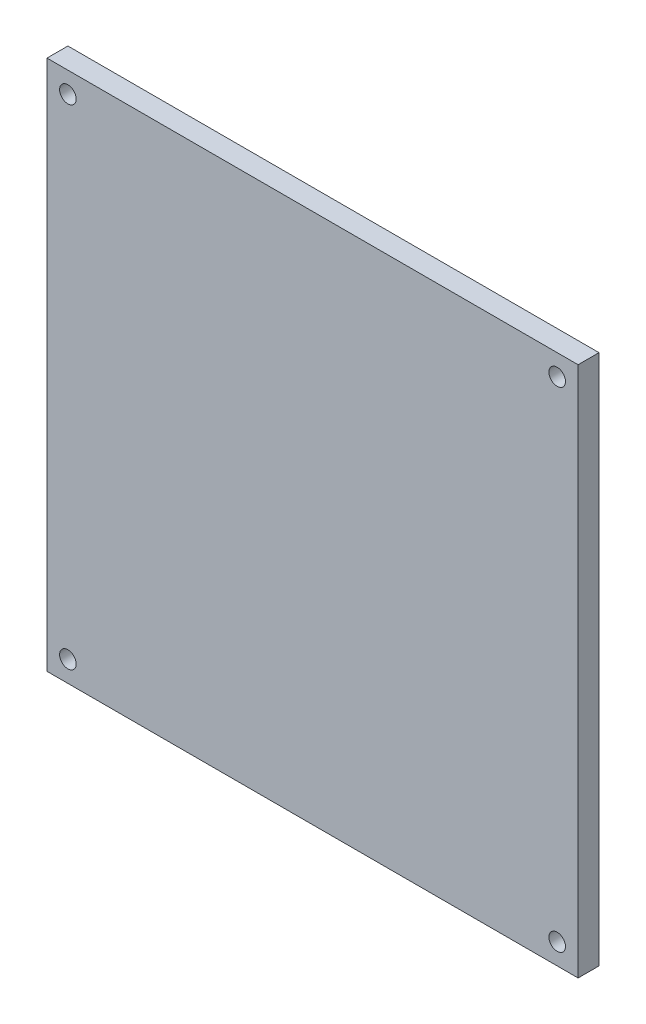
ISO-10303-21;
HEADER;
FILE_DESCRIPTION(('STEP AP214'),'2;1');
FILE_NAME('part.step','',(''),(''),'','','');
FILE_SCHEMA(('AUTOMOTIVE_DESIGN { 1 0 10303 214 1 1 1 1 }'));
ENDSEC;
DATA;
#1=APPLICATION_CONTEXT('core data for automotive mechanical design processes');
#2=APPLICATION_PROTOCOL_DEFINITION('international standard','automotive_design',2000,#1);
#3=PRODUCT_CONTEXT('',#1,'mechanical');
#4=PRODUCT('Part','Part','',(#3));
#5=PRODUCT_RELATED_PRODUCT_CATEGORY('part','',(#4));
#6=PRODUCT_DEFINITION_FORMATION('','',#4);
#7=PRODUCT_DEFINITION_CONTEXT('part definition',#1,'design');
#8=PRODUCT_DEFINITION('design','',#6,#7);
#9=PRODUCT_DEFINITION_SHAPE('','',#8);
#10=(LENGTH_UNIT() NAMED_UNIT(*) SI_UNIT(.MILLI.,.METRE.));
#11=(NAMED_UNIT(*) PLANE_ANGLE_UNIT() SI_UNIT($,.RADIAN.));
#12=(NAMED_UNIT(*) SI_UNIT($,.STERADIAN.) SOLID_ANGLE_UNIT());
#13=UNCERTAINTY_MEASURE_WITH_UNIT(LENGTH_MEASURE(1.E-05),#10,'distance_accuracy_value','');
#14=(GEOMETRIC_REPRESENTATION_CONTEXT(3) GLOBAL_UNCERTAINTY_ASSIGNED_CONTEXT((#13)) GLOBAL_UNIT_ASSIGNED_CONTEXT((#10,
#11,#12)) REPRESENTATION_CONTEXT('',''));
#15=CARTESIAN_POINT('',(0.,0.,0.));
#16=DIRECTION('',(0.,0.,1.));
#17=DIRECTION('',(1.,0.,0.));
#18=AXIS2_PLACEMENT_3D('',#15,#16,#17);
#19=CARTESIAN_POINT('',(0.,0.,5.));
#20=DIRECTION('',(0.,0.,-1.));
#21=DIRECTION('',(-1.,0.,0.));
#22=AXIS2_PLACEMENT_3D('',#19,#20,#21);
#23=PLANE('',#22);
#24=DIRECTION('',(0.,1.,0.));
#25=VECTOR('',#24,1.);
#26=CARTESIAN_POINT('',(122.,122.,5.));
#27=LINE('',#26,#25);
#28=CARTESIAN_POINT('',(122.,-5.,5.));
#29=VERTEX_POINT('',#28);
#30=CARTESIAN_POINT('',(122.,122.,5.));
#31=VERTEX_POINT('',#30);
#32=EDGE_CURVE('E87',#29,#31,#27,.T.);
#33=ORIENTED_EDGE('',*,*,#32,.T.);
#34=DIRECTION('',(-1.,0.,0.));
#35=VECTOR('',#34,1.);
#36=CARTESIAN_POINT('',(-5.,122.,5.));
#37=LINE('',#36,#35);
#38=CARTESIAN_POINT('',(-5.,122.,5.));
#39=VERTEX_POINT('',#38);
#40=EDGE_CURVE('E82',#31,#39,#37,.T.);
#41=ORIENTED_EDGE('',*,*,#40,.T.);
#42=DIRECTION('',(0.,-1.,0.));
#43=VECTOR('',#42,1.);
#44=CARTESIAN_POINT('',(-5.,-5.,5.));
#45=LINE('',#44,#43);
#46=CARTESIAN_POINT('',(-5.,-5.,5.));
#47=VERTEX_POINT('',#46);
#48=EDGE_CURVE('E85',#39,#47,#45,.T.);
#49=ORIENTED_EDGE('',*,*,#48,.T.);
#50=DIRECTION('',(1.,0.,0.));
#51=VECTOR('',#50,1.);
#52=CARTESIAN_POINT('',(122.,-5.,5.));
#53=LINE('',#52,#51);
#54=EDGE_CURVE('E52',#47,#29,#53,.T.);
#55=ORIENTED_EDGE('',*,*,#54,.T.);
#56=EDGE_LOOP('',(#33,#41,#49,#55));
#57=FACE_BOUND('',#56,.T.);
#58=CARTESIAN_POINT('',(0.,0.,5.));
#59=DIRECTION('',(0.,0.,1.));
#60=DIRECTION('',(1.,0.,0.));
#61=AXIS2_PLACEMENT_3D('',#58,#59,#60);
#62=CIRCLE('',#61,1.981);
#63=CARTESIAN_POINT('',(1.981,0.,5.));
#64=VERTEX_POINT('',#63);
#65=EDGE_CURVE('E102',#64,#64,#62,.T.);
#66=ORIENTED_EDGE('',*,*,#65,.F.);
#67=EDGE_LOOP('',(#66));
#68=FACE_BOUND('',#67,.T.);
#69=CARTESIAN_POINT('',(117.,0.,5.));
#70=DIRECTION('',(0.,0.,1.));
#71=DIRECTION('',(1.,0.,0.));
#72=AXIS2_PLACEMENT_3D('',#69,#70,#71);
#73=CIRCLE('',#72,1.981);
#74=CARTESIAN_POINT('',(118.981,0.,5.));
#75=VERTEX_POINT('',#74);
#76=EDGE_CURVE('E117',#75,#75,#73,.T.);
#77=ORIENTED_EDGE('',*,*,#76,.F.);
#78=EDGE_LOOP('',(#77));
#79=FACE_BOUND('',#78,.T.);
#80=CARTESIAN_POINT('',(117.,117.,5.));
#81=DIRECTION('',(0.,0.,1.));
#82=DIRECTION('',(1.,0.,0.));
#83=AXIS2_PLACEMENT_3D('',#80,#81,#82);
#84=CIRCLE('',#83,1.981);
#85=CARTESIAN_POINT('',(118.981,117.,5.));
#86=VERTEX_POINT('',#85);
#87=EDGE_CURVE('E123',#86,#86,#84,.T.);
#88=ORIENTED_EDGE('',*,*,#87,.F.);
#89=EDGE_LOOP('',(#88));
#90=FACE_BOUND('',#89,.T.);
#91=CARTESIAN_POINT('',(0.,117.,5.));
#92=DIRECTION('',(0.,0.,1.));
#93=DIRECTION('',(1.,0.,0.));
#94=AXIS2_PLACEMENT_3D('',#91,#92,#93);
#95=CIRCLE('',#94,1.981);
#96=CARTESIAN_POINT('',(1.981,117.,5.));
#97=VERTEX_POINT('',#96);
#98=EDGE_CURVE('E129',#97,#97,#95,.T.);
#99=ORIENTED_EDGE('',*,*,#98,.F.);
#100=EDGE_LOOP('',(#99));
#101=FACE_BOUND('',#100,.T.);
#102=ADVANCED_FACE('F35',(#57,#68,#79,#90,#101),#23,.F.);
#103=CARTESIAN_POINT('',(0.,0.,0.));
#104=DIRECTION('',(0.,0.,-1.));
#105=DIRECTION('',(-1.,0.,0.));
#106=AXIS2_PLACEMENT_3D('',#103,#104,#105);
#107=PLANE('',#106);
#108=CARTESIAN_POINT('',(117.,117.,0.));
#109=DIRECTION('',(0.,0.,1.));
#110=DIRECTION('',(1.,0.,0.));
#111=AXIS2_PLACEMENT_3D('',#108,#109,#110);
#112=CIRCLE('',#111,1.981);
#113=CARTESIAN_POINT('',(118.981,117.,0.));
#114=VERTEX_POINT('',#113);
#115=EDGE_CURVE('E126',#114,#114,#112,.T.);
#116=ORIENTED_EDGE('',*,*,#115,.T.);
#117=EDGE_LOOP('',(#116));
#118=FACE_BOUND('',#117,.T.);
#119=CARTESIAN_POINT('',(0.,0.,0.));
#120=DIRECTION('',(0.,0.,1.));
#121=DIRECTION('',(1.,0.,0.));
#122=AXIS2_PLACEMENT_3D('',#119,#120,#121);
#123=CIRCLE('',#122,1.981);
#124=CARTESIAN_POINT('',(1.981,0.,0.));
#125=VERTEX_POINT('',#124);
#126=EDGE_CURVE('E114',#125,#125,#123,.T.);
#127=ORIENTED_EDGE('',*,*,#126,.T.);
#128=EDGE_LOOP('',(#127));
#129=FACE_BOUND('',#128,.T.);
#130=DIRECTION('',(0.,1.,0.));
#131=VECTOR('',#130,1.);
#132=CARTESIAN_POINT('',(122.,122.,0.));
#133=LINE('',#132,#131);
#134=CARTESIAN_POINT('',(122.,-5.,0.));
#135=VERTEX_POINT('',#134);
#136=CARTESIAN_POINT('',(122.,122.,0.));
#137=VERTEX_POINT('',#136);
#138=EDGE_CURVE('E99',#135,#137,#133,.T.);
#139=ORIENTED_EDGE('',*,*,#138,.F.);
#140=DIRECTION('',(1.,0.,0.));
#141=VECTOR('',#140,1.);
#142=CARTESIAN_POINT('',(122.,-5.,0.));
#143=LINE('',#142,#141);
#144=CARTESIAN_POINT('',(-5.,-5.,0.));
#145=VERTEX_POINT('',#144);
#146=EDGE_CURVE('E75',#145,#135,#143,.T.);
#147=ORIENTED_EDGE('',*,*,#146,.F.);
#148=DIRECTION('',(0.,-1.,0.));
#149=VECTOR('',#148,1.);
#150=CARTESIAN_POINT('',(-5.,-5.,0.));
#151=LINE('',#150,#149);
#152=CARTESIAN_POINT('',(-5.,122.,0.));
#153=VERTEX_POINT('',#152);
#154=EDGE_CURVE('E69',#153,#145,#151,.T.);
#155=ORIENTED_EDGE('',*,*,#154,.F.);
#156=DIRECTION('',(-1.,0.,0.));
#157=VECTOR('',#156,1.);
#158=CARTESIAN_POINT('',(-5.,122.,0.));
#159=LINE('',#158,#157);
#160=EDGE_CURVE('E91',#137,#153,#159,.T.);
#161=ORIENTED_EDGE('',*,*,#160,.F.);
#162=EDGE_LOOP('',(#139,#147,#155,#161));
#163=FACE_BOUND('',#162,.T.);
#164=CARTESIAN_POINT('',(117.,0.,0.));
#165=DIRECTION('',(0.,0.,1.));
#166=DIRECTION('',(1.,0.,0.));
#167=AXIS2_PLACEMENT_3D('',#164,#165,#166);
#168=CIRCLE('',#167,1.981);
#169=CARTESIAN_POINT('',(118.981,0.,0.));
#170=VERTEX_POINT('',#169);
#171=EDGE_CURVE('E120',#170,#170,#168,.T.);
#172=ORIENTED_EDGE('',*,*,#171,.T.);
#173=EDGE_LOOP('',(#172));
#174=FACE_BOUND('',#173,.T.);
#175=CARTESIAN_POINT('',(0.,117.,0.));
#176=DIRECTION('',(0.,0.,1.));
#177=DIRECTION('',(1.,0.,0.));
#178=AXIS2_PLACEMENT_3D('',#175,#176,#177);
#179=CIRCLE('',#178,1.981);
#180=CARTESIAN_POINT('',(1.981,117.,0.));
#181=VERTEX_POINT('',#180);
#182=EDGE_CURVE('E132',#181,#181,#179,.T.);
#183=ORIENTED_EDGE('',*,*,#182,.T.);
#184=EDGE_LOOP('',(#183));
#185=FACE_BOUND('',#184,.T.);
#186=ADVANCED_FACE('F110',(#118,#129,#163,#174,#185),#107,.T.);
#187=CARTESIAN_POINT('',(122.,122.,5.));
#188=DIRECTION('',(-1.,0.,0.));
#189=DIRECTION('',(0.,0.,1.));
#190=AXIS2_PLACEMENT_3D('',#187,#188,#189);
#191=PLANE('',#190);
#192=ORIENTED_EDGE('',*,*,#138,.T.);
#193=DIRECTION('',(0.,0.,-1.));
#194=VECTOR('',#193,1.);
#195=CARTESIAN_POINT('',(122.,122.,5.));
#196=LINE('',#195,#194);
#197=EDGE_CURVE('E11',#31,#137,#196,.T.);
#198=ORIENTED_EDGE('',*,*,#197,.F.);
#199=ORIENTED_EDGE('',*,*,#32,.F.);
#200=DIRECTION('',(0.,0.,-1.));
#201=VECTOR('',#200,1.);
#202=CARTESIAN_POINT('',(122.,-5.,5.));
#203=LINE('',#202,#201);
#204=EDGE_CURVE('E95',#29,#135,#203,.T.);
#205=ORIENTED_EDGE('',*,*,#204,.T.);
#206=EDGE_LOOP('',(#192,#198,#199,#205));
#207=FACE_BOUND('',#206,.T.);
#208=ADVANCED_FACE('F37',(#207),#191,.F.);
#209=CARTESIAN_POINT('',(-5.,122.,5.));
#210=DIRECTION('',(0.,-1.,0.));
#211=DIRECTION('',(0.,0.,-1.));
#212=AXIS2_PLACEMENT_3D('',#209,#210,#211);
#213=PLANE('',#212);
#214=ORIENTED_EDGE('',*,*,#160,.T.);
#215=DIRECTION('',(0.,0.,-1.));
#216=VECTOR('',#215,1.);
#217=CARTESIAN_POINT('',(-5.,122.,5.));
#218=LINE('',#217,#216);
#219=EDGE_CURVE('E44',#39,#153,#218,.T.);
#220=ORIENTED_EDGE('',*,*,#219,.F.);
#221=ORIENTED_EDGE('',*,*,#40,.F.);
#222=ORIENTED_EDGE('',*,*,#197,.T.);
#223=EDGE_LOOP('',(#214,#220,#221,#222));
#224=FACE_BOUND('',#223,.T.);
#225=ADVANCED_FACE('F90',(#224),#213,.F.);
#226=CARTESIAN_POINT('',(-5.,-5.,5.));
#227=DIRECTION('',(1.,0.,0.));
#228=DIRECTION('',(0.,0.,-1.));
#229=AXIS2_PLACEMENT_3D('',#226,#227,#228);
#230=PLANE('',#229);
#231=ORIENTED_EDGE('',*,*,#154,.T.);
#232=DIRECTION('',(0.,0.,-1.));
#233=VECTOR('',#232,1.);
#234=CARTESIAN_POINT('',(-5.,-5.,5.));
#235=LINE('',#234,#233);
#236=EDGE_CURVE('E92',#47,#145,#235,.T.);
#237=ORIENTED_EDGE('',*,*,#236,.F.);
#238=ORIENTED_EDGE('',*,*,#48,.F.);
#239=ORIENTED_EDGE('',*,*,#219,.T.);
#240=EDGE_LOOP('',(#231,#237,#238,#239));
#241=FACE_BOUND('',#240,.T.);
#242=ADVANCED_FACE('F93',(#241),#230,.F.);
#243=CARTESIAN_POINT('',(122.,-5.,5.));
#244=DIRECTION('',(0.,1.,0.));
#245=DIRECTION('',(0.,0.,1.));
#246=AXIS2_PLACEMENT_3D('',#243,#244,#245);
#247=PLANE('',#246);
#248=ORIENTED_EDGE('',*,*,#146,.T.);
#249=ORIENTED_EDGE('',*,*,#204,.F.);
#250=ORIENTED_EDGE('',*,*,#54,.F.);
#251=ORIENTED_EDGE('',*,*,#236,.T.);
#252=EDGE_LOOP('',(#248,#249,#250,#251));
#253=FACE_BOUND('',#252,.T.);
#254=ADVANCED_FACE('F107',(#253),#247,.F.);
#255=CARTESIAN_POINT('',(0.,0.,5.));
#256=DIRECTION('',(0.,0.,-1.));
#257=DIRECTION('',(-1.,0.,0.));
#258=AXIS2_PLACEMENT_3D('',#255,#256,#257);
#259=CYLINDRICAL_SURFACE('',#258,1.981);
#260=ORIENTED_EDGE('',*,*,#126,.F.);
#261=EDGE_LOOP('',(#260));
#262=FACE_BOUND('',#261,.T.);
#263=ORIENTED_EDGE('',*,*,#65,.T.);
#264=EDGE_LOOP('',(#263));
#265=FACE_BOUND('',#264,.T.);
#266=ADVANCED_FACE('F148',(#262,#265),#259,.F.);
#267=CARTESIAN_POINT('',(117.,0.,5.));
#268=DIRECTION('',(0.,0.,-1.));
#269=DIRECTION('',(-1.,0.,0.));
#270=AXIS2_PLACEMENT_3D('',#267,#268,#269);
#271=CYLINDRICAL_SURFACE('',#270,1.981);
#272=ORIENTED_EDGE('',*,*,#171,.F.);
#273=EDGE_LOOP('',(#272));
#274=FACE_BOUND('',#273,.T.);
#275=ORIENTED_EDGE('',*,*,#76,.T.);
#276=EDGE_LOOP('',(#275));
#277=FACE_BOUND('',#276,.T.);
#278=ADVANCED_FACE('F194',(#274,#277),#271,.F.);
#279=CARTESIAN_POINT('',(117.,117.,5.));
#280=DIRECTION('',(0.,0.,-1.));
#281=DIRECTION('',(-1.,0.,0.));
#282=AXIS2_PLACEMENT_3D('',#279,#280,#281);
#283=CYLINDRICAL_SURFACE('',#282,1.981);
#284=ORIENTED_EDGE('',*,*,#115,.F.);
#285=EDGE_LOOP('',(#284));
#286=FACE_BOUND('',#285,.T.);
#287=ORIENTED_EDGE('',*,*,#87,.T.);
#288=EDGE_LOOP('',(#287));
#289=FACE_BOUND('',#288,.T.);
#290=ADVANCED_FACE('F205',(#286,#289),#283,.F.);
#291=CARTESIAN_POINT('',(0.,117.,5.));
#292=DIRECTION('',(0.,0.,-1.));
#293=DIRECTION('',(-1.,0.,0.));
#294=AXIS2_PLACEMENT_3D('',#291,#292,#293);
#295=CYLINDRICAL_SURFACE('',#294,1.981);
#296=ORIENTED_EDGE('',*,*,#182,.F.);
#297=EDGE_LOOP('',(#296));
#298=FACE_BOUND('',#297,.T.);
#299=ORIENTED_EDGE('',*,*,#98,.T.);
#300=EDGE_LOOP('',(#299));
#301=FACE_BOUND('',#300,.T.);
#302=ADVANCED_FACE('F138',(#298,#301),#295,.F.);
#303=CLOSED_SHELL('',(#102,#186,#208,#225,#242,#254,#266,#278,#290,#302));
#304=MANIFOLD_SOLID_BREP('B2',#303);
#305=ADVANCED_BREP_SHAPE_REPRESENTATION('',(#18,#304),#14);
#306=SHAPE_DEFINITION_REPRESENTATION(#9,#305);
ENDSEC;
END-ISO-10303-21;
